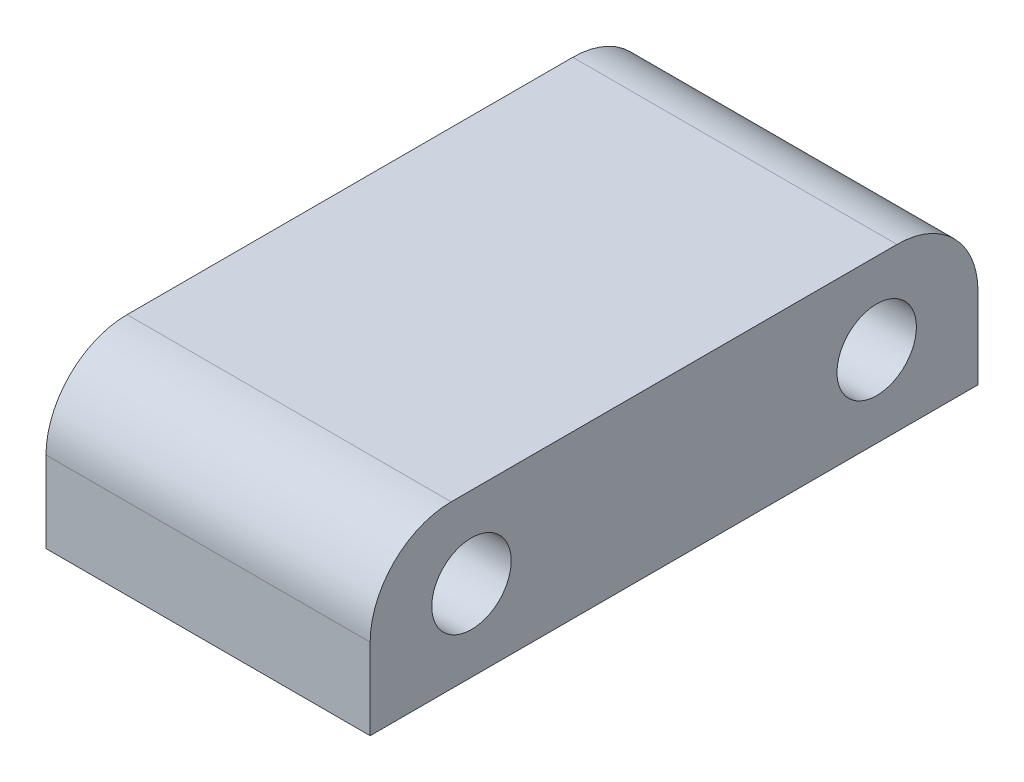
ISO-10303-21;
HEADER;
FILE_DESCRIPTION(('STEP AP214'),'2;1');
FILE_NAME('part.step','',(''),(''),'','','');
FILE_SCHEMA(('AUTOMOTIVE_DESIGN { 1 0 10303 214 1 1 1 1 }'));
ENDSEC;
DATA;
#1=APPLICATION_CONTEXT('core data for automotive mechanical design processes');
#2=APPLICATION_PROTOCOL_DEFINITION('international standard','automotive_design',2000,#1);
#3=PRODUCT_CONTEXT('',#1,'mechanical');
#4=PRODUCT('Part','Part','',(#3));
#5=PRODUCT_RELATED_PRODUCT_CATEGORY('part','',(#4));
#6=PRODUCT_DEFINITION_FORMATION('','',#4);
#7=PRODUCT_DEFINITION_CONTEXT('part definition',#1,'design');
#8=PRODUCT_DEFINITION('design','',#6,#7);
#9=PRODUCT_DEFINITION_SHAPE('','',#8);
#10=(LENGTH_UNIT() NAMED_UNIT(*) SI_UNIT(.MILLI.,.METRE.));
#11=(NAMED_UNIT(*) PLANE_ANGLE_UNIT() SI_UNIT($,.RADIAN.));
#12=(NAMED_UNIT(*) SI_UNIT($,.STERADIAN.) SOLID_ANGLE_UNIT());
#13=UNCERTAINTY_MEASURE_WITH_UNIT(LENGTH_MEASURE(1.E-05),#10,'distance_accuracy_value','');
#14=(GEOMETRIC_REPRESENTATION_CONTEXT(3) GLOBAL_UNCERTAINTY_ASSIGNED_CONTEXT((#13)) GLOBAL_UNIT_ASSIGNED_CONTEXT((#10,
#11,#12)) REPRESENTATION_CONTEXT('',''));
#15=CARTESIAN_POINT('',(0.,0.,0.));
#16=DIRECTION('',(0.,0.,1.));
#17=DIRECTION('',(1.,0.,0.));
#18=AXIS2_PLACEMENT_3D('',#15,#16,#17);
#19=CARTESIAN_POINT('',(20.,0.,0.));
#20=DIRECTION('',(-1.,0.,0.));
#21=DIRECTION('',(0.,0.,1.));
#22=AXIS2_PLACEMENT_3D('',#19,#20,#21);
#23=PLANE('',#22);
#24=DIRECTION('',(0.,1.,0.));
#25=VECTOR('',#24,1.);
#26=CARTESIAN_POINT('',(20.,-10.,-37.5));
#27=LINE('',#26,#25);
#28=CARTESIAN_POINT('',(20.,-10.,-37.5));
#29=VERTEX_POINT('',#28);
#30=CARTESIAN_POINT('',(20.,0.,-37.5));
#31=VERTEX_POINT('',#30);
#32=EDGE_CURVE('E139',#29,#31,#27,.T.);
#33=ORIENTED_EDGE('',*,*,#32,.T.);
#34=CARTESIAN_POINT('',(20.,0.,-27.5));
#35=DIRECTION('',(-1.,0.,0.));
#36=DIRECTION('',(0.,0.,1.));
#37=AXIS2_PLACEMENT_3D('',#34,#35,#36);
#38=CIRCLE('',#37,10.);
#39=CARTESIAN_POINT('',(20.,10.,-27.5));
#40=VERTEX_POINT('',#39);
#41=EDGE_CURVE('E52',#31,#40,#38,.F.);
#42=ORIENTED_EDGE('',*,*,#41,.T.);
#43=DIRECTION('',(0.,0.,1.));
#44=VECTOR('',#43,1.);
#45=CARTESIAN_POINT('',(20.,10.,37.5));
#46=LINE('',#45,#44);
#47=CARTESIAN_POINT('',(20.,10.,27.5));
#48=VERTEX_POINT('',#47);
#49=EDGE_CURVE('E106',#40,#48,#46,.T.);
#50=ORIENTED_EDGE('',*,*,#49,.T.);
#51=CARTESIAN_POINT('',(20.,0.,27.5));
#52=DIRECTION('',(-1.,0.,0.));
#53=DIRECTION('',(0.,0.,1.));
#54=AXIS2_PLACEMENT_3D('',#51,#52,#53);
#55=CIRCLE('',#54,10.);
#56=CARTESIAN_POINT('',(20.,0.,37.5));
#57=VERTEX_POINT('',#56);
#58=EDGE_CURVE('E59',#48,#57,#55,.F.);
#59=ORIENTED_EDGE('',*,*,#58,.T.);
#60=DIRECTION('',(0.,-1.,0.));
#61=VECTOR('',#60,1.);
#62=CARTESIAN_POINT('',(20.,-10.,37.5));
#63=LINE('',#62,#61);
#64=CARTESIAN_POINT('',(20.,-10.,37.5));
#65=VERTEX_POINT('',#64);
#66=EDGE_CURVE('E97',#57,#65,#63,.T.);
#67=ORIENTED_EDGE('',*,*,#66,.T.);
#68=DIRECTION('',(0.,0.,-1.));
#69=VECTOR('',#68,1.);
#70=CARTESIAN_POINT('',(20.,-10.,37.5));
#71=LINE('',#70,#69);
#72=EDGE_CURVE('E101',#65,#29,#71,.T.);
#73=ORIENTED_EDGE('',*,*,#72,.T.);
#74=EDGE_LOOP('',(#33,#42,#50,#59,#67,#73));
#75=FACE_BOUND('',#74,.T.);
#76=CARTESIAN_POINT('',(20.,0.,25.));
#77=DIRECTION('',(1.,0.,0.));
#78=DIRECTION('',(0.,0.,-1.));
#79=AXIS2_PLACEMENT_3D('',#76,#77,#78);
#80=CIRCLE('',#79,4.9);
#81=CARTESIAN_POINT('',(20.,0.,20.1));
#82=VERTEX_POINT('',#81);
#83=EDGE_CURVE('E131',#82,#82,#80,.T.);
#84=ORIENTED_EDGE('',*,*,#83,.F.);
#85=EDGE_LOOP('',(#84));
#86=FACE_BOUND('',#85,.T.);
#87=CARTESIAN_POINT('',(20.,0.,-25.));
#88=DIRECTION('',(1.,0.,0.));
#89=DIRECTION('',(0.,0.,-1.));
#90=AXIS2_PLACEMENT_3D('',#87,#88,#89);
#91=CIRCLE('',#90,4.9);
#92=CARTESIAN_POINT('',(20.,0.,-29.9));
#93=VERTEX_POINT('',#92);
#94=EDGE_CURVE('E179',#93,#93,#91,.T.);
#95=ORIENTED_EDGE('',*,*,#94,.F.);
#96=EDGE_LOOP('',(#95));
#97=FACE_BOUND('',#96,.T.);
#98=ADVANCED_FACE('F43',(#75,#86,#97),#23,.F.);
#99=CARTESIAN_POINT('',(-20.,0.,0.));
#100=DIRECTION('',(-1.,0.,0.));
#101=DIRECTION('',(0.,0.,1.));
#102=AXIS2_PLACEMENT_3D('',#99,#100,#101);
#103=PLANE('',#102);
#104=CARTESIAN_POINT('',(-20.,0.,25.));
#105=DIRECTION('',(1.,0.,0.));
#106=DIRECTION('',(0.,0.,-1.));
#107=AXIS2_PLACEMENT_3D('',#104,#105,#106);
#108=CIRCLE('',#107,4.9);
#109=CARTESIAN_POINT('',(-20.,0.,20.1));
#110=VERTEX_POINT('',#109);
#111=EDGE_CURVE('E175',#110,#110,#108,.T.);
#112=ORIENTED_EDGE('',*,*,#111,.T.);
#113=EDGE_LOOP('',(#112));
#114=FACE_BOUND('',#113,.T.);
#115=DIRECTION('',(0.,0.,1.));
#116=VECTOR('',#115,1.);
#117=CARTESIAN_POINT('',(-20.,10.,37.5));
#118=LINE('',#117,#116);
#119=CARTESIAN_POINT('',(-20.,10.,-27.5));
#120=VERTEX_POINT('',#119);
#121=CARTESIAN_POINT('',(-20.,10.,27.5));
#122=VERTEX_POINT('',#121);
#123=EDGE_CURVE('E130',#120,#122,#118,.T.);
#124=ORIENTED_EDGE('',*,*,#123,.F.);
#125=CARTESIAN_POINT('',(-20.,0.,-27.5));
#126=DIRECTION('',(-1.,0.,0.));
#127=DIRECTION('',(0.,0.,1.));
#128=AXIS2_PLACEMENT_3D('',#125,#126,#127);
#129=CIRCLE('',#128,10.);
#130=CARTESIAN_POINT('',(-20.,0.,-37.5));
#131=VERTEX_POINT('',#130);
#132=EDGE_CURVE('E150',#120,#131,#129,.T.);
#133=ORIENTED_EDGE('',*,*,#132,.T.);
#134=DIRECTION('',(0.,1.,0.));
#135=VECTOR('',#134,1.);
#136=CARTESIAN_POINT('',(-20.,-10.,-37.5));
#137=LINE('',#136,#135);
#138=CARTESIAN_POINT('',(-20.,-10.,-37.5));
#139=VERTEX_POINT('',#138);
#140=EDGE_CURVE('E127',#139,#131,#137,.T.);
#141=ORIENTED_EDGE('',*,*,#140,.F.);
#142=DIRECTION('',(0.,0.,-1.));
#143=VECTOR('',#142,1.);
#144=CARTESIAN_POINT('',(-20.,-10.,37.5));
#145=LINE('',#144,#143);
#146=CARTESIAN_POINT('',(-20.,-10.,37.5));
#147=VERTEX_POINT('',#146);
#148=EDGE_CURVE('E137',#147,#139,#145,.T.);
#149=ORIENTED_EDGE('',*,*,#148,.F.);
#150=DIRECTION('',(0.,-1.,0.));
#151=VECTOR('',#150,1.);
#152=CARTESIAN_POINT('',(-20.,-10.,37.5));
#153=LINE('',#152,#151);
#154=CARTESIAN_POINT('',(-20.,0.,37.5));
#155=VERTEX_POINT('',#154);
#156=EDGE_CURVE('E112',#155,#147,#153,.T.);
#157=ORIENTED_EDGE('',*,*,#156,.F.);
#158=CARTESIAN_POINT('',(-20.,0.,27.5));
#159=DIRECTION('',(-1.,0.,0.));
#160=DIRECTION('',(0.,0.,1.));
#161=AXIS2_PLACEMENT_3D('',#158,#159,#160);
#162=CIRCLE('',#161,10.);
#163=EDGE_CURVE('E147',#155,#122,#162,.T.);
#164=ORIENTED_EDGE('',*,*,#163,.T.);
#165=EDGE_LOOP('',(#124,#133,#141,#149,#157,#164));
#166=FACE_BOUND('',#165,.T.);
#167=CARTESIAN_POINT('',(-20.,0.,-25.));
#168=DIRECTION('',(1.,0.,0.));
#169=DIRECTION('',(0.,0.,-1.));
#170=AXIS2_PLACEMENT_3D('',#167,#168,#169);
#171=CIRCLE('',#170,4.9);
#172=CARTESIAN_POINT('',(-20.,0.,-29.9));
#173=VERTEX_POINT('',#172);
#174=EDGE_CURVE('E183',#173,#173,#171,.T.);
#175=ORIENTED_EDGE('',*,*,#174,.T.);
#176=EDGE_LOOP('',(#175));
#177=FACE_BOUND('',#176,.T.);
#178=ADVANCED_FACE('F169',(#114,#166,#177),#103,.T.);
#179=CARTESIAN_POINT('',(20.,-10.,-37.5));
#180=DIRECTION('',(0.,0.,1.));
#181=DIRECTION('',(1.,0.,0.));
#182=AXIS2_PLACEMENT_3D('',#179,#180,#181);
#183=PLANE('',#182);
#184=ORIENTED_EDGE('',*,*,#140,.T.);
#185=DIRECTION('',(-1.,0.,0.));
#186=VECTOR('',#185,1.);
#187=CARTESIAN_POINT('',(20.,0.,-37.5));
#188=LINE('',#187,#186);
#189=EDGE_CURVE('E67',#131,#31,#188,.F.);
#190=ORIENTED_EDGE('',*,*,#189,.T.);
#191=ORIENTED_EDGE('',*,*,#32,.F.);
#192=DIRECTION('',(-1.,0.,0.));
#193=VECTOR('',#192,1.);
#194=CARTESIAN_POINT('',(20.,-10.,-37.5));
#195=LINE('',#194,#193);
#196=EDGE_CURVE('E117',#29,#139,#195,.T.);
#197=ORIENTED_EDGE('',*,*,#196,.T.);
#198=EDGE_LOOP('',(#184,#190,#191,#197));
#199=FACE_BOUND('',#198,.T.);
#200=ADVANCED_FACE('F171',(#199),#183,.F.);
#201=CARTESIAN_POINT('',(20.,10.,37.5));
#202=DIRECTION('',(0.,-1.,0.));
#203=DIRECTION('',(0.,0.,-1.));
#204=AXIS2_PLACEMENT_3D('',#201,#202,#203);
#205=PLANE('',#204);
#206=ORIENTED_EDGE('',*,*,#49,.F.);
#207=DIRECTION('',(-1.,0.,0.));
#208=VECTOR('',#207,1.);
#209=CARTESIAN_POINT('',(20.,10.,-27.5));
#210=LINE('',#209,#208);
#211=EDGE_CURVE('E143',#40,#120,#210,.T.);
#212=ORIENTED_EDGE('',*,*,#211,.T.);
#213=ORIENTED_EDGE('',*,*,#123,.T.);
#214=DIRECTION('',(-1.,0.,0.));
#215=VECTOR('',#214,1.);
#216=CARTESIAN_POINT('',(20.,10.,27.5));
#217=LINE('',#216,#215);
#218=EDGE_CURVE('E116',#122,#48,#217,.F.);
#219=ORIENTED_EDGE('',*,*,#218,.T.);
#220=EDGE_LOOP('',(#206,#212,#213,#219));
#221=FACE_BOUND('',#220,.T.);
#222=ADVANCED_FACE('F162',(#221),#205,.F.);
#223=CARTESIAN_POINT('',(20.,-10.,37.5));
#224=DIRECTION('',(0.,0.,-1.));
#225=DIRECTION('',(-1.,0.,0.));
#226=AXIS2_PLACEMENT_3D('',#223,#224,#225);
#227=PLANE('',#226);
#228=ORIENTED_EDGE('',*,*,#66,.F.);
#229=DIRECTION('',(-1.,0.,0.));
#230=VECTOR('',#229,1.);
#231=CARTESIAN_POINT('',(20.,0.,37.5));
#232=LINE('',#231,#230);
#233=EDGE_CURVE('E11',#57,#155,#232,.T.);
#234=ORIENTED_EDGE('',*,*,#233,.T.);
#235=ORIENTED_EDGE('',*,*,#156,.T.);
#236=DIRECTION('',(-1.,0.,0.));
#237=VECTOR('',#236,1.);
#238=CARTESIAN_POINT('',(20.,-10.,37.5));
#239=LINE('',#238,#237);
#240=EDGE_CURVE('E109',#65,#147,#239,.T.);
#241=ORIENTED_EDGE('',*,*,#240,.F.);
#242=EDGE_LOOP('',(#228,#234,#235,#241));
#243=FACE_BOUND('',#242,.T.);
#244=ADVANCED_FACE('F110',(#243),#227,.F.);
#245=CARTESIAN_POINT('',(20.,-10.,37.5));
#246=DIRECTION('',(0.,1.,0.));
#247=DIRECTION('',(0.,0.,1.));
#248=AXIS2_PLACEMENT_3D('',#245,#246,#247);
#249=PLANE('',#248);
#250=ORIENTED_EDGE('',*,*,#148,.T.);
#251=ORIENTED_EDGE('',*,*,#196,.F.);
#252=ORIENTED_EDGE('',*,*,#72,.F.);
#253=ORIENTED_EDGE('',*,*,#240,.T.);
#254=EDGE_LOOP('',(#250,#251,#252,#253));
#255=FACE_BOUND('',#254,.T.);
#256=ADVANCED_FACE('F119',(#255),#249,.F.);
#257=CARTESIAN_POINT('',(20.,0.,25.));
#258=DIRECTION('',(-1.,0.,0.));
#259=DIRECTION('',(0.,0.,1.));
#260=AXIS2_PLACEMENT_3D('',#257,#258,#259);
#261=CYLINDRICAL_SURFACE('',#260,4.9);
#262=ORIENTED_EDGE('',*,*,#83,.T.);
#263=EDGE_LOOP('',(#262));
#264=FACE_BOUND('',#263,.T.);
#265=ORIENTED_EDGE('',*,*,#111,.F.);
#266=EDGE_LOOP('',(#265));
#267=FACE_BOUND('',#266,.T.);
#268=ADVANCED_FACE('F202',(#264,#267),#261,.F.);
#269=CARTESIAN_POINT('',(20.,0.,-25.));
#270=DIRECTION('',(-1.,0.,0.));
#271=DIRECTION('',(0.,0.,1.));
#272=AXIS2_PLACEMENT_3D('',#269,#270,#271);
#273=CYLINDRICAL_SURFACE('',#272,4.9);
#274=ORIENTED_EDGE('',*,*,#94,.T.);
#275=EDGE_LOOP('',(#274));
#276=FACE_BOUND('',#275,.T.);
#277=ORIENTED_EDGE('',*,*,#174,.F.);
#278=EDGE_LOOP('',(#277));
#279=FACE_BOUND('',#278,.T.);
#280=ADVANCED_FACE('F191',(#276,#279),#273,.F.);
#281=CARTESIAN_POINT('',(20.,0.,-27.5));
#282=DIRECTION('',(-1.,0.,0.));
#283=DIRECTION('',(0.,0.,1.));
#284=AXIS2_PLACEMENT_3D('',#281,#282,#283);
#285=CYLINDRICAL_SURFACE('',#284,10.);
#286=ORIENTED_EDGE('',*,*,#41,.F.);
#287=ORIENTED_EDGE('',*,*,#189,.F.);
#288=ORIENTED_EDGE('',*,*,#132,.F.);
#289=ORIENTED_EDGE('',*,*,#211,.F.);
#290=EDGE_LOOP('',(#286,#287,#288,#289));
#291=FACE_BOUND('',#290,.T.);
#292=ADVANCED_FACE('F166',(#291),#285,.T.);
#293=CARTESIAN_POINT('',(20.,0.,27.5));
#294=DIRECTION('',(-1.,0.,0.));
#295=DIRECTION('',(0.,0.,1.));
#296=AXIS2_PLACEMENT_3D('',#293,#294,#295);
#297=CYLINDRICAL_SURFACE('',#296,10.);
#298=ORIENTED_EDGE('',*,*,#58,.F.);
#299=ORIENTED_EDGE('',*,*,#218,.F.);
#300=ORIENTED_EDGE('',*,*,#163,.F.);
#301=ORIENTED_EDGE('',*,*,#233,.F.);
#302=EDGE_LOOP('',(#298,#299,#300,#301));
#303=FACE_BOUND('',#302,.T.);
#304=ADVANCED_FACE('F45',(#303),#297,.T.);
#305=CLOSED_SHELL('',(#98,#178,#200,#222,#244,#256,#268,#280,#292,#304));
#306=MANIFOLD_SOLID_BREP('B2',#305);
#307=ADVANCED_BREP_SHAPE_REPRESENTATION('',(#18,#306),#14);
#308=SHAPE_DEFINITION_REPRESENTATION(#9,#307);
ENDSEC;
END-ISO-10303-21;
